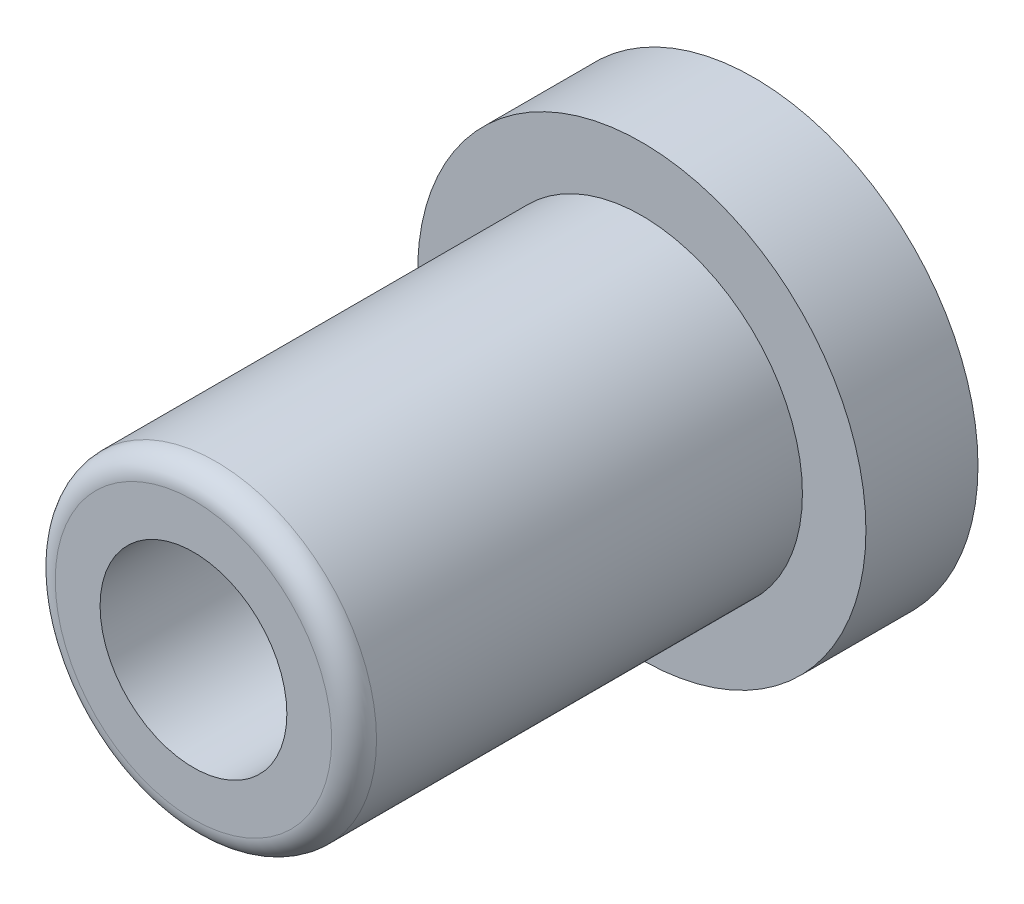
ISO-10303-21;
HEADER;
FILE_DESCRIPTION(('STEP AP214'),'2;1');
FILE_NAME('part.step','',(''),(''),'','','');
FILE_SCHEMA(('AUTOMOTIVE_DESIGN { 1 0 10303 214 1 1 1 1 }'));
ENDSEC;
DATA;
#1=APPLICATION_CONTEXT('core data for automotive mechanical design processes');
#2=APPLICATION_PROTOCOL_DEFINITION('international standard','automotive_design',2000,#1);
#3=PRODUCT_CONTEXT('',#1,'mechanical');
#4=PRODUCT('Part','Part','',(#3));
#5=PRODUCT_RELATED_PRODUCT_CATEGORY('part','',(#4));
#6=PRODUCT_DEFINITION_FORMATION('','',#4);
#7=PRODUCT_DEFINITION_CONTEXT('part definition',#1,'design');
#8=PRODUCT_DEFINITION('design','',#6,#7);
#9=PRODUCT_DEFINITION_SHAPE('','',#8);
#10=(LENGTH_UNIT() NAMED_UNIT(*) SI_UNIT(.MILLI.,.METRE.));
#11=(NAMED_UNIT(*) PLANE_ANGLE_UNIT() SI_UNIT($,.RADIAN.));
#12=(NAMED_UNIT(*) SI_UNIT($,.STERADIAN.) SOLID_ANGLE_UNIT());
#13=UNCERTAINTY_MEASURE_WITH_UNIT(LENGTH_MEASURE(1.E-05),#10,'distance_accuracy_value','');
#14=(GEOMETRIC_REPRESENTATION_CONTEXT(3) GLOBAL_UNCERTAINTY_ASSIGNED_CONTEXT((#13)) GLOBAL_UNIT_ASSIGNED_CONTEXT((#10,
#11,#12)) REPRESENTATION_CONTEXT('',''));
#15=CARTESIAN_POINT('',(0.,0.,0.));
#16=DIRECTION('',(0.,0.,1.));
#17=DIRECTION('',(1.,0.,0.));
#18=AXIS2_PLACEMENT_3D('',#15,#16,#17);
#19=CARTESIAN_POINT('',(-15.3412603148863,7.91521060842434,0.));
#20=DIRECTION('',(0.,0.,1.));
#21=DIRECTION('',(1.,0.,0.));
#22=AXIS2_PLACEMENT_3D('',#19,#20,#21);
#23=PLANE('',#22);
#24=CARTESIAN_POINT('',(-15.3412603148863,7.91521060842434,0.));
#25=DIRECTION('',(0.,0.,1.));
#26=DIRECTION('',(1.,0.,0.));
#27=AXIS2_PLACEMENT_3D('',#24,#25,#26);
#28=CIRCLE('',#27,3.);
#29=CARTESIAN_POINT('',(-12.3412603148863,7.91521060842434,0.));
#30=VERTEX_POINT('',#29);
#31=EDGE_CURVE('E43',#30,#30,#28,.T.);
#32=ORIENTED_EDGE('',*,*,#31,.F.);
#33=EDGE_LOOP('',(#32));
#34=FACE_BOUND('',#33,.T.);
#35=CARTESIAN_POINT('',(-15.3412603148863,7.91521060842434,0.));
#36=DIRECTION('',(0.,0.,-1.));
#37=DIRECTION('',(-1.,0.,0.));
#38=AXIS2_PLACEMENT_3D('',#35,#36,#37);
#39=CIRCLE('',#38,1.25);
#40=CARTESIAN_POINT('',(-16.5912603148863,7.91521060842434,0.));
#41=VERTEX_POINT('',#40);
#42=EDGE_CURVE('E54',#41,#41,#39,.T.);
#43=ORIENTED_EDGE('',*,*,#42,.F.);
#44=EDGE_LOOP('',(#43));
#45=FACE_BOUND('',#44,.T.);
#46=ADVANCED_FACE('F28',(#34,#45),#23,.F.);
#47=CARTESIAN_POINT('',(-15.3412603148863,7.91521060842434,1.5));
#48=DIRECTION('',(0.,0.,1.));
#49=DIRECTION('',(1.,0.,0.));
#50=AXIS2_PLACEMENT_3D('',#47,#48,#49);
#51=PLANE('',#50);
#52=CARTESIAN_POINT('',(-15.3412603148863,7.91521060842434,1.5));
#53=DIRECTION('',(0.,0.,1.));
#54=DIRECTION('',(1.,0.,0.));
#55=AXIS2_PLACEMENT_3D('',#52,#53,#54);
#56=CIRCLE('',#55,3.);
#57=CARTESIAN_POINT('',(-12.3412603148863,7.91521060842434,1.5));
#58=VERTEX_POINT('',#57);
#59=EDGE_CURVE('E39',#58,#58,#56,.T.);
#60=ORIENTED_EDGE('',*,*,#59,.T.);
#61=EDGE_LOOP('',(#60));
#62=FACE_BOUND('',#61,.T.);
#63=CARTESIAN_POINT('',(-15.3412603148863,7.91521060842434,1.5));
#64=DIRECTION('',(0.,0.,1.));
#65=DIRECTION('',(1.,0.,0.));
#66=AXIS2_PLACEMENT_3D('',#63,#64,#65);
#67=CIRCLE('',#66,2.15);
#68=CARTESIAN_POINT('',(-13.1912603148863,7.91521060842434,1.5));
#69=VERTEX_POINT('',#68);
#70=EDGE_CURVE('E47',#69,#69,#67,.T.);
#71=ORIENTED_EDGE('',*,*,#70,.F.);
#72=EDGE_LOOP('',(#71));
#73=FACE_BOUND('',#72,.T.);
#74=ADVANCED_FACE('F62',(#62,#73),#51,.T.);
#75=CARTESIAN_POINT('',(-15.3412603148863,7.91521060842434,1.5));
#76=DIRECTION('',(0.,0.,-1.));
#77=DIRECTION('',(-1.,0.,0.));
#78=AXIS2_PLACEMENT_3D('',#75,#76,#77);
#79=CYLINDRICAL_SURFACE('',#78,3.);
#80=ORIENTED_EDGE('',*,*,#59,.F.);
#81=EDGE_LOOP('',(#80));
#82=FACE_BOUND('',#81,.T.);
#83=ORIENTED_EDGE('',*,*,#31,.T.);
#84=EDGE_LOOP('',(#83));
#85=FACE_BOUND('',#84,.T.);
#86=ADVANCED_FACE('F68',(#82,#85),#79,.T.);
#87=CARTESIAN_POINT('',(-15.3412603148863,7.91521060842434,7.5));
#88=DIRECTION('',(0.,0.,-1.));
#89=DIRECTION('',(-1.,0.,0.));
#90=AXIS2_PLACEMENT_3D('',#87,#88,#89);
#91=CYLINDRICAL_SURFACE('',#90,2.15);
#92=CARTESIAN_POINT('',(-15.3412603148863,7.91521060842434,7.2));
#93=DIRECTION('',(0.,0.,1.));
#94=DIRECTION('',(1.,0.,0.));
#95=AXIS2_PLACEMENT_3D('',#92,#93,#94);
#96=CIRCLE('',#95,2.15);
#97=CARTESIAN_POINT('',(-13.1912603148863,7.91521060842434,7.2));
#98=VERTEX_POINT('',#97);
#99=EDGE_CURVE('E10',#98,#98,#96,.F.);
#100=ORIENTED_EDGE('',*,*,#99,.T.);
#101=EDGE_LOOP('',(#100));
#102=FACE_BOUND('',#101,.T.);
#103=ORIENTED_EDGE('',*,*,#70,.T.);
#104=EDGE_LOOP('',(#103));
#105=FACE_BOUND('',#104,.T.);
#106=ADVANCED_FACE('F74',(#102,#105),#91,.T.);
#107=CARTESIAN_POINT('',(-15.3412603148863,7.91521060842434,7.5));
#108=DIRECTION('',(0.,0.,1.));
#109=DIRECTION('',(1.,0.,0.));
#110=AXIS2_PLACEMENT_3D('',#107,#108,#109);
#111=PLANE('',#110);
#112=CARTESIAN_POINT('',(-15.3412603148863,7.91521060842434,7.5));
#113=DIRECTION('',(0.,0.,1.));
#114=DIRECTION('',(1.,0.,0.));
#115=AXIS2_PLACEMENT_3D('',#112,#113,#114);
#116=CIRCLE('',#115,1.85);
#117=CARTESIAN_POINT('',(-13.4912603148863,7.91521060842434,7.5));
#118=VERTEX_POINT('',#117);
#119=EDGE_CURVE('E35',#118,#118,#116,.T.);
#120=ORIENTED_EDGE('',*,*,#119,.T.);
#121=EDGE_LOOP('',(#120));
#122=FACE_BOUND('',#121,.T.);
#123=CARTESIAN_POINT('',(-15.3412603148863,7.91521060842434,7.5));
#124=DIRECTION('',(0.,0.,1.));
#125=DIRECTION('',(1.,0.,0.));
#126=AXIS2_PLACEMENT_3D('',#123,#124,#125);
#127=CIRCLE('',#126,1.25);
#128=CARTESIAN_POINT('',(-14.0912603148863,7.91521060842434,7.5));
#129=VERTEX_POINT('',#128);
#130=EDGE_CURVE('E51',#129,#129,#127,.T.);
#131=ORIENTED_EDGE('',*,*,#130,.F.);
#132=EDGE_LOOP('',(#131));
#133=FACE_BOUND('',#132,.T.);
#134=ADVANCED_FACE('F79',(#122,#133),#111,.T.);
#135=CARTESIAN_POINT('',(-15.3412603148863,7.91521060842434,0.));
#136=DIRECTION('',(0.,0.,-1.));
#137=DIRECTION('',(-1.,0.,0.));
#138=AXIS2_PLACEMENT_3D('',#135,#136,#137);
#139=CYLINDRICAL_SURFACE('',#138,1.25);
#140=ORIENTED_EDGE('',*,*,#42,.T.);
#141=EDGE_LOOP('',(#140));
#142=FACE_BOUND('',#141,.T.);
#143=ORIENTED_EDGE('',*,*,#130,.T.);
#144=EDGE_LOOP('',(#143));
#145=FACE_BOUND('',#144,.T.);
#146=ADVANCED_FACE('F58',(#142,#145),#139,.F.);
#147=CARTESIAN_POINT('',(-15.3412603148863,7.91521060842434,7.2));
#148=DIRECTION('',(0.,0.,1.));
#149=DIRECTION('',(1.,0.,0.));
#150=AXIS2_PLACEMENT_3D('',#147,#148,#149);
#151=TOROIDAL_SURFACE('',#150,1.85,0.3);
#152=ORIENTED_EDGE('',*,*,#99,.F.);
#153=EDGE_LOOP('',(#152));
#154=FACE_BOUND('',#153,.T.);
#155=ORIENTED_EDGE('',*,*,#119,.F.);
#156=EDGE_LOOP('',(#155));
#157=FACE_BOUND('',#156,.T.);
#158=ADVANCED_FACE('F30',(#154,#157),#151,.T.);
#159=CLOSED_SHELL('',(#46,#74,#86,#106,#134,#146,#158));
#160=MANIFOLD_SOLID_BREP('B2',#159);
#161=ADVANCED_BREP_SHAPE_REPRESENTATION('',(#18,#160),#14);
#162=SHAPE_DEFINITION_REPRESENTATION(#9,#161);
ENDSEC;
END-ISO-10303-21;
